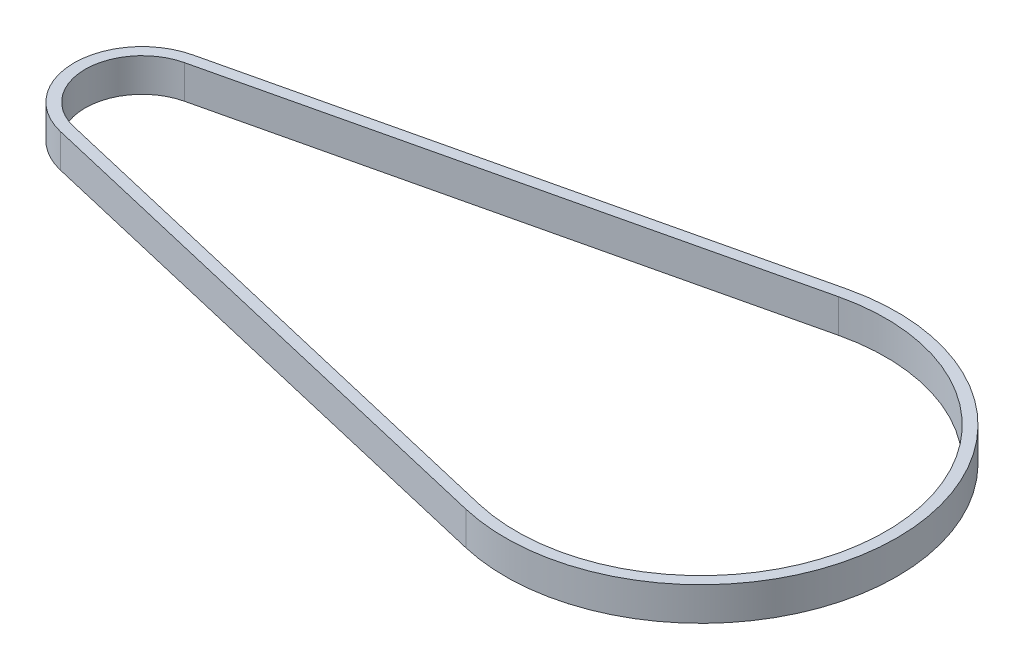
ISO-10303-21;
HEADER;
FILE_DESCRIPTION(('STEP AP214'),'2;1');
FILE_NAME('part.step','',(''),(''),'','','');
FILE_SCHEMA(('AUTOMOTIVE_DESIGN { 1 0 10303 214 1 1 1 1 }'));
ENDSEC;
DATA;
#1=APPLICATION_CONTEXT('core data for automotive mechanical design processes');
#2=APPLICATION_PROTOCOL_DEFINITION('international standard','automotive_design',2000,#1);
#3=PRODUCT_CONTEXT('',#1,'mechanical');
#4=PRODUCT('Part','Part','',(#3));
#5=PRODUCT_RELATED_PRODUCT_CATEGORY('part','',(#4));
#6=PRODUCT_DEFINITION_FORMATION('','',#4);
#7=PRODUCT_DEFINITION_CONTEXT('part definition',#1,'design');
#8=PRODUCT_DEFINITION('design','',#6,#7);
#9=PRODUCT_DEFINITION_SHAPE('','',#8);
#10=(LENGTH_UNIT() NAMED_UNIT(*) SI_UNIT(.MILLI.,.METRE.));
#11=(NAMED_UNIT(*) PLANE_ANGLE_UNIT() SI_UNIT($,.RADIAN.));
#12=(NAMED_UNIT(*) SI_UNIT($,.STERADIAN.) SOLID_ANGLE_UNIT());
#13=UNCERTAINTY_MEASURE_WITH_UNIT(LENGTH_MEASURE(1.E-05),#10,'distance_accuracy_value','');
#14=(GEOMETRIC_REPRESENTATION_CONTEXT(3) GLOBAL_UNCERTAINTY_ASSIGNED_CONTEXT((#13)) GLOBAL_UNIT_ASSIGNED_CONTEXT((#10,
#11,#12)) REPRESENTATION_CONTEXT('',''));
#15=CARTESIAN_POINT('',(0.,0.,0.));
#16=DIRECTION('',(0.,0.,1.));
#17=DIRECTION('',(1.,0.,0.));
#18=AXIS2_PLACEMENT_3D('',#15,#16,#17);
#19=CARTESIAN_POINT('',(-50.120399982,3.,0.));
#20=DIRECTION('',(0.,1.,0.));
#21=DIRECTION('',(0.,0.,1.));
#22=AXIS2_PLACEMENT_3D('',#19,#20,#21);
#23=PLANE('',#22);
#24=CARTESIAN_POINT('',(-50.120399982,3.,0.));
#25=DIRECTION('',(0.,1.,0.));
#26=DIRECTION('',(0.,0.,1.));
#27=AXIS2_PLACEMENT_3D('',#24,#25,#26);
#28=CIRCLE('',#27,6.09999996);
#29=CARTESIAN_POINT('',(-51.5139443234475,3.,-5.93868955918894));
#30=VERTEX_POINT('',#29);
#31=CARTESIAN_POINT('',(-51.5139443234475,3.,5.93868955918894));
#32=VERTEX_POINT('',#31);
#33=EDGE_CURVE('E134',#30,#32,#28,.T.);
#34=ORIENTED_EDGE('',*,*,#33,.T.);
#35=DIRECTION('',(0.973555671824782,0.,0.228449893538601));
#36=VECTOR('',#35,1.);
#37=CARTESIAN_POINT('',(-51.5139443234475,3.,5.93868955918894));
#38=LINE('',#37,#36);
#39=CARTESIAN_POINT('',(-4.00929563160245,3.,17.0859020405249));
#40=VERTEX_POINT('',#39);
#41=EDGE_CURVE('E137',#32,#40,#38,.T.);
#42=ORIENTED_EDGE('',*,*,#41,.T.);
#43=CARTESIAN_POINT('',(0.,3.,0.));
#44=DIRECTION('',(0.,1.,0.));
#45=DIRECTION('',(0.,0.,1.));
#46=AXIS2_PLACEMENT_3D('',#43,#44,#45);
#47=CIRCLE('',#46,17.55);
#48=CARTESIAN_POINT('',(-4.00929563160243,3.,-17.0859020405249));
#49=VERTEX_POINT('',#48);
#50=EDGE_CURVE('E140',#40,#49,#47,.T.);
#51=ORIENTED_EDGE('',*,*,#50,.T.);
#52=DIRECTION('',(-0.973555671824782,0.,0.228449893538601));
#53=VECTOR('',#52,1.);
#54=CARTESIAN_POINT('',(-51.5139443234475,3.,-5.93868955918894));
#55=LINE('',#54,#53);
#56=EDGE_CURVE('E142',#49,#30,#55,.T.);
#57=ORIENTED_EDGE('',*,*,#56,.T.);
#58=EDGE_LOOP('',(#34,#42,#51,#57));
#59=FACE_BOUND('',#58,.T.);
#60=DIRECTION('',(0.973555671824782,0.,0.228449893538601));
#61=VECTOR('',#60,1.);
#62=CARTESIAN_POINT('',(-51.2854944299089,3.,4.96513388736416));
#63=LINE('',#62,#61);
#64=CARTESIAN_POINT('',(-51.2854944299089,3.,4.96513388736416));
#65=VERTEX_POINT('',#64);
#66=CARTESIAN_POINT('',(-3.78084573806385,3.,16.1123463687001));
#67=VERTEX_POINT('',#66);
#68=EDGE_CURVE('E106',#65,#67,#63,.T.);
#69=ORIENTED_EDGE('',*,*,#68,.F.);
#70=CARTESIAN_POINT('',(-50.120399982,3.,0.));
#71=DIRECTION('',(0.,1.,0.));
#72=DIRECTION('',(0.,0.,1.));
#73=AXIS2_PLACEMENT_3D('',#70,#71,#72);
#74=CIRCLE('',#73,5.09999996);
#75=CARTESIAN_POINT('',(-51.2854944299089,3.,-4.96513388736416));
#76=VERTEX_POINT('',#75);
#77=EDGE_CURVE('E98',#76,#65,#74,.T.);
#78=ORIENTED_EDGE('',*,*,#77,.F.);
#79=DIRECTION('',(-0.973555671824782,0.,0.228449893538601));
#80=VECTOR('',#79,1.);
#81=CARTESIAN_POINT('',(-51.2854944299089,3.,-4.96513388736416));
#82=LINE('',#81,#80);
#83=CARTESIAN_POINT('',(-3.78084573806384,3.,-16.1123463687001));
#84=VERTEX_POINT('',#83);
#85=EDGE_CURVE('E120',#84,#76,#82,.T.);
#86=ORIENTED_EDGE('',*,*,#85,.F.);
#87=CARTESIAN_POINT('',(0.,3.,0.));
#88=DIRECTION('',(0.,1.,0.));
#89=DIRECTION('',(0.,0.,1.));
#90=AXIS2_PLACEMENT_3D('',#87,#88,#89);
#91=CIRCLE('',#90,16.55);
#92=EDGE_CURVE('E118',#67,#84,#91,.T.);
#93=ORIENTED_EDGE('',*,*,#92,.F.);
#94=EDGE_LOOP('',(#69,#78,#86,#93));
#95=FACE_BOUND('',#94,.T.);
#96=ADVANCED_FACE('F33',(#59,#95),#23,.T.);
#97=CARTESIAN_POINT('',(-50.120399982,0.,0.));
#98=DIRECTION('',(0.,1.,0.));
#99=DIRECTION('',(0.,0.,1.));
#100=AXIS2_PLACEMENT_3D('',#97,#98,#99);
#101=PLANE('',#100);
#102=CARTESIAN_POINT('',(-50.120399982,0.,0.));
#103=DIRECTION('',(0.,1.,0.));
#104=DIRECTION('',(0.,0.,1.));
#105=AXIS2_PLACEMENT_3D('',#102,#103,#104);
#106=CIRCLE('',#105,6.09999996);
#107=CARTESIAN_POINT('',(-51.5139443234475,0.,-5.93868955918894));
#108=VERTEX_POINT('',#107);
#109=CARTESIAN_POINT('',(-51.5139443234475,0.,5.93868955918894));
#110=VERTEX_POINT('',#109);
#111=EDGE_CURVE('E114',#108,#110,#106,.T.);
#112=ORIENTED_EDGE('',*,*,#111,.F.);
#113=DIRECTION('',(-0.973555671824782,0.,0.228449893538601));
#114=VECTOR('',#113,1.);
#115=CARTESIAN_POINT('',(-51.5139443234475,0.,-5.93868955918894));
#116=LINE('',#115,#114);
#117=CARTESIAN_POINT('',(-4.00929563160243,0.,-17.0859020405249));
#118=VERTEX_POINT('',#117);
#119=EDGE_CURVE('E138',#118,#108,#116,.T.);
#120=ORIENTED_EDGE('',*,*,#119,.F.);
#121=CARTESIAN_POINT('',(0.,0.,0.));
#122=DIRECTION('',(0.,1.,0.));
#123=DIRECTION('',(0.,0.,1.));
#124=AXIS2_PLACEMENT_3D('',#121,#122,#123);
#125=CIRCLE('',#124,17.55);
#126=CARTESIAN_POINT('',(-4.00929563160245,0.,17.0859020405249));
#127=VERTEX_POINT('',#126);
#128=EDGE_CURVE('E149',#127,#118,#125,.T.);
#129=ORIENTED_EDGE('',*,*,#128,.F.);
#130=DIRECTION('',(0.973555671824782,0.,0.228449893538601));
#131=VECTOR('',#130,1.);
#132=CARTESIAN_POINT('',(-51.5139443234475,0.,5.93868955918894));
#133=LINE('',#132,#131);
#134=EDGE_CURVE('E147',#110,#127,#133,.T.);
#135=ORIENTED_EDGE('',*,*,#134,.F.);
#136=EDGE_LOOP('',(#112,#120,#129,#135));
#137=FACE_BOUND('',#136,.T.);
#138=CARTESIAN_POINT('',(-50.120399982,0.,0.));
#139=DIRECTION('',(0.,1.,0.));
#140=DIRECTION('',(0.,0.,1.));
#141=AXIS2_PLACEMENT_3D('',#138,#139,#140);
#142=CIRCLE('',#141,5.09999996);
#143=CARTESIAN_POINT('',(-51.2854944299089,0.,-4.96513388736416));
#144=VERTEX_POINT('',#143);
#145=CARTESIAN_POINT('',(-51.2854944299089,0.,4.96513388736416));
#146=VERTEX_POINT('',#145);
#147=EDGE_CURVE('E56',#144,#146,#142,.T.);
#148=ORIENTED_EDGE('',*,*,#147,.T.);
#149=DIRECTION('',(0.973555671824782,0.,0.228449893538601));
#150=VECTOR('',#149,1.);
#151=CARTESIAN_POINT('',(-51.2854944299089,0.,4.96513388736416));
#152=LINE('',#151,#150);
#153=CARTESIAN_POINT('',(-3.78084573806385,0.,16.1123463687001));
#154=VERTEX_POINT('',#153);
#155=EDGE_CURVE('E113',#146,#154,#152,.T.);
#156=ORIENTED_EDGE('',*,*,#155,.T.);
#157=CARTESIAN_POINT('',(0.,0.,0.));
#158=DIRECTION('',(0.,1.,0.));
#159=DIRECTION('',(0.,0.,1.));
#160=AXIS2_PLACEMENT_3D('',#157,#158,#159);
#161=CIRCLE('',#160,16.55);
#162=CARTESIAN_POINT('',(-3.78084573806385,0.,-16.1123463687001));
#163=VERTEX_POINT('',#162);
#164=EDGE_CURVE('E126',#154,#163,#161,.T.);
#165=ORIENTED_EDGE('',*,*,#164,.T.);
#166=DIRECTION('',(-0.973555671824782,0.,0.228449893538601));
#167=VECTOR('',#166,1.);
#168=CARTESIAN_POINT('',(-51.2854944299089,0.,-4.96513388736416));
#169=LINE('',#168,#167);
#170=EDGE_CURVE('E107',#163,#144,#169,.T.);
#171=ORIENTED_EDGE('',*,*,#170,.T.);
#172=EDGE_LOOP('',(#148,#156,#165,#171));
#173=FACE_BOUND('',#172,.T.);
#174=ADVANCED_FACE('F167',(#137,#173),#101,.F.);
#175=CARTESIAN_POINT('',(-50.120399982,3.,0.));
#176=DIRECTION('',(0.,-1.,0.));
#177=DIRECTION('',(0.,0.,-1.));
#178=AXIS2_PLACEMENT_3D('',#175,#176,#177);
#179=CYLINDRICAL_SURFACE('',#178,6.09999996);
#180=ORIENTED_EDGE('',*,*,#111,.T.);
#181=DIRECTION('',(0.,-1.,0.));
#182=VECTOR('',#181,1.);
#183=CARTESIAN_POINT('',(-51.5139443234475,3.,5.93868955918894));
#184=LINE('',#183,#182);
#185=EDGE_CURVE('E11',#32,#110,#184,.T.);
#186=ORIENTED_EDGE('',*,*,#185,.F.);
#187=ORIENTED_EDGE('',*,*,#33,.F.);
#188=DIRECTION('',(0.,-1.,0.));
#189=VECTOR('',#188,1.);
#190=CARTESIAN_POINT('',(-51.5139443234475,3.,-5.93868955918894));
#191=LINE('',#190,#189);
#192=EDGE_CURVE('E144',#30,#108,#191,.T.);
#193=ORIENTED_EDGE('',*,*,#192,.T.);
#194=EDGE_LOOP('',(#180,#186,#187,#193));
#195=FACE_BOUND('',#194,.T.);
#196=ADVANCED_FACE('F35',(#195),#179,.T.);
#197=CARTESIAN_POINT('',(-51.5139443234475,3.,5.93868955918894));
#198=DIRECTION('',(0.228449893538601,0.,-0.973555671824782));
#199=DIRECTION('',(-0.973555671824782,0.,-0.228449893538601));
#200=AXIS2_PLACEMENT_3D('',#197,#198,#199);
#201=PLANE('',#200);
#202=ORIENTED_EDGE('',*,*,#134,.T.);
#203=DIRECTION('',(0.,-1.,0.));
#204=VECTOR('',#203,1.);
#205=CARTESIAN_POINT('',(-4.00929563160245,3.,17.0859020405249));
#206=LINE('',#205,#204);
#207=EDGE_CURVE('E41',#40,#127,#206,.T.);
#208=ORIENTED_EDGE('',*,*,#207,.F.);
#209=ORIENTED_EDGE('',*,*,#41,.F.);
#210=ORIENTED_EDGE('',*,*,#185,.T.);
#211=EDGE_LOOP('',(#202,#208,#209,#210));
#212=FACE_BOUND('',#211,.T.);
#213=ADVANCED_FACE('F177',(#212),#201,.F.);
#214=CARTESIAN_POINT('',(0.,3.,0.));
#215=DIRECTION('',(0.,-1.,0.));
#216=DIRECTION('',(0.,0.,-1.));
#217=AXIS2_PLACEMENT_3D('',#214,#215,#216);
#218=CYLINDRICAL_SURFACE('',#217,17.55);
#219=ORIENTED_EDGE('',*,*,#128,.T.);
#220=DIRECTION('',(0.,-1.,0.));
#221=VECTOR('',#220,1.);
#222=CARTESIAN_POINT('',(-4.00929563160243,3.,-17.0859020405249));
#223=LINE('',#222,#221);
#224=EDGE_CURVE('E154',#49,#118,#223,.T.);
#225=ORIENTED_EDGE('',*,*,#224,.F.);
#226=ORIENTED_EDGE('',*,*,#50,.F.);
#227=ORIENTED_EDGE('',*,*,#207,.T.);
#228=EDGE_LOOP('',(#219,#225,#226,#227));
#229=FACE_BOUND('',#228,.T.);
#230=ADVANCED_FACE('F161',(#229),#218,.T.);
#231=CARTESIAN_POINT('',(-51.5139443234475,3.,-5.93868955918894));
#232=DIRECTION('',(0.228449893538601,0.,0.973555671824782));
#233=DIRECTION('',(0.973555671824782,0.,-0.228449893538601));
#234=AXIS2_PLACEMENT_3D('',#231,#232,#233);
#235=PLANE('',#234);
#236=ORIENTED_EDGE('',*,*,#119,.T.);
#237=ORIENTED_EDGE('',*,*,#192,.F.);
#238=ORIENTED_EDGE('',*,*,#56,.F.);
#239=ORIENTED_EDGE('',*,*,#224,.T.);
#240=EDGE_LOOP('',(#236,#237,#238,#239));
#241=FACE_BOUND('',#240,.T.);
#242=ADVANCED_FACE('F171',(#241),#235,.F.);
#243=CARTESIAN_POINT('',(-50.120399982,3.,0.));
#244=DIRECTION('',(0.,-1.,0.));
#245=DIRECTION('',(0.,0.,-1.));
#246=AXIS2_PLACEMENT_3D('',#243,#244,#245);
#247=CYLINDRICAL_SURFACE('',#246,5.09999996);
#248=ORIENTED_EDGE('',*,*,#147,.F.);
#249=DIRECTION('',(0.,-1.,0.));
#250=VECTOR('',#249,1.);
#251=CARTESIAN_POINT('',(-51.2854944299089,3.,-4.96513388736416));
#252=LINE('',#251,#250);
#253=EDGE_CURVE('E102',#76,#144,#252,.T.);
#254=ORIENTED_EDGE('',*,*,#253,.F.);
#255=ORIENTED_EDGE('',*,*,#77,.T.);
#256=DIRECTION('',(0.,-1.,0.));
#257=VECTOR('',#256,1.);
#258=CARTESIAN_POINT('',(-51.2854944299089,3.,4.96513388736416));
#259=LINE('',#258,#257);
#260=EDGE_CURVE('E101',#65,#146,#259,.T.);
#261=ORIENTED_EDGE('',*,*,#260,.T.);
#262=EDGE_LOOP('',(#248,#254,#255,#261));
#263=FACE_BOUND('',#262,.T.);
#264=ADVANCED_FACE('F100',(#263),#247,.F.);
#265=CARTESIAN_POINT('',(-51.2854944299089,3.,4.96513388736416));
#266=DIRECTION('',(0.228449893538601,0.,-0.973555671824781));
#267=DIRECTION('',(-0.973555671824782,0.,-0.228449893538601));
#268=AXIS2_PLACEMENT_3D('',#265,#266,#267);
#269=PLANE('',#268);
#270=ORIENTED_EDGE('',*,*,#155,.F.);
#271=ORIENTED_EDGE('',*,*,#260,.F.);
#272=ORIENTED_EDGE('',*,*,#68,.T.);
#273=DIRECTION('',(0.,-1.,0.));
#274=VECTOR('',#273,1.);
#275=CARTESIAN_POINT('',(-3.78084573806385,3.,16.1123463687001));
#276=LINE('',#275,#274);
#277=EDGE_CURVE('E115',#67,#154,#276,.T.);
#278=ORIENTED_EDGE('',*,*,#277,.T.);
#279=EDGE_LOOP('',(#270,#271,#272,#278));
#280=FACE_BOUND('',#279,.T.);
#281=ADVANCED_FACE('F110',(#280),#269,.T.);
#282=CARTESIAN_POINT('',(0.,3.,0.));
#283=DIRECTION('',(0.,-1.,0.));
#284=DIRECTION('',(0.,0.,-1.));
#285=AXIS2_PLACEMENT_3D('',#282,#283,#284);
#286=CYLINDRICAL_SURFACE('',#285,16.55);
#287=ORIENTED_EDGE('',*,*,#164,.F.);
#288=ORIENTED_EDGE('',*,*,#277,.F.);
#289=ORIENTED_EDGE('',*,*,#92,.T.);
#290=DIRECTION('',(0.,-1.,0.));
#291=VECTOR('',#290,1.);
#292=CARTESIAN_POINT('',(-3.78084573806385,3.,-16.1123463687001));
#293=LINE('',#292,#291);
#294=EDGE_CURVE('E48',#84,#163,#293,.T.);
#295=ORIENTED_EDGE('',*,*,#294,.T.);
#296=EDGE_LOOP('',(#287,#288,#289,#295));
#297=FACE_BOUND('',#296,.T.);
#298=ADVANCED_FACE('F200',(#297),#286,.F.);
#299=CARTESIAN_POINT('',(-51.2854944299089,3.,-4.96513388736416));
#300=DIRECTION('',(0.228449893538601,0.,0.973555671824781));
#301=DIRECTION('',(0.973555671824782,0.,-0.228449893538601));
#302=AXIS2_PLACEMENT_3D('',#299,#300,#301);
#303=PLANE('',#302);
#304=ORIENTED_EDGE('',*,*,#170,.F.);
#305=ORIENTED_EDGE('',*,*,#294,.F.);
#306=ORIENTED_EDGE('',*,*,#85,.T.);
#307=ORIENTED_EDGE('',*,*,#253,.T.);
#308=EDGE_LOOP('',(#304,#305,#306,#307));
#309=FACE_BOUND('',#308,.T.);
#310=ADVANCED_FACE('F204',(#309),#303,.T.);
#311=CLOSED_SHELL('',(#96,#174,#196,#213,#230,#242,#264,#281,#298,#310));
#312=MANIFOLD_SOLID_BREP('B2',#311);
#313=ADVANCED_BREP_SHAPE_REPRESENTATION('',(#18,#312),#14);
#314=SHAPE_DEFINITION_REPRESENTATION(#9,#313);
ENDSEC;
END-ISO-10303-21;
